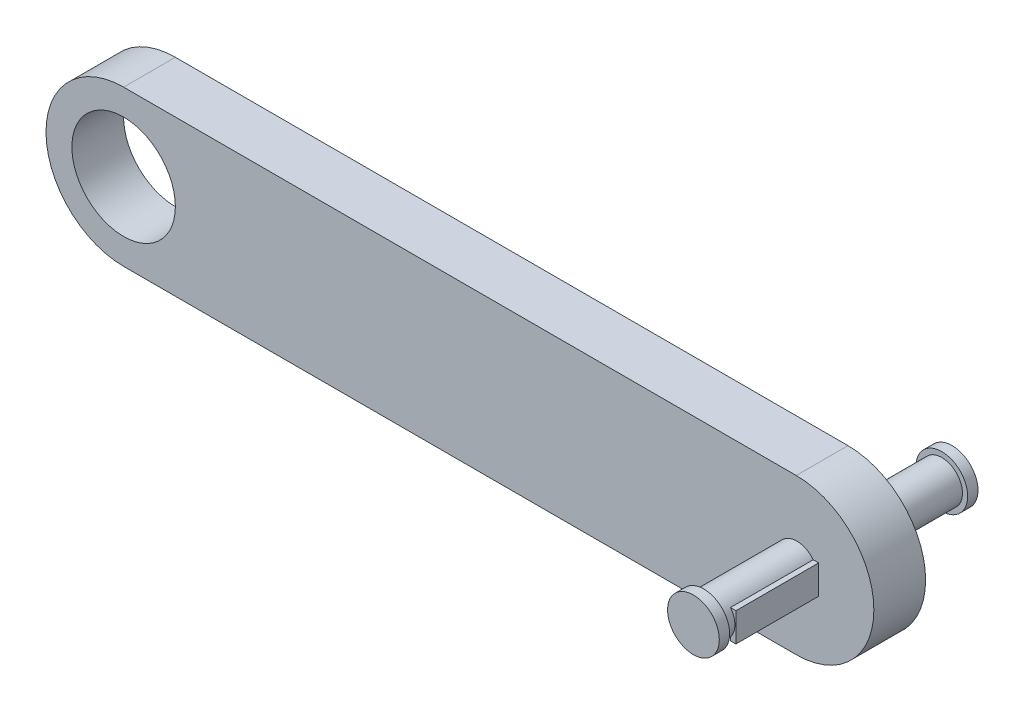
ISO-10303-21;
HEADER;
FILE_DESCRIPTION(('STEP AP214'),'2;1');
FILE_NAME('part.step','',(''),(''),'','','');
FILE_SCHEMA(('AUTOMOTIVE_DESIGN { 1 0 10303 214 1 1 1 1 }'));
ENDSEC;
DATA;
#1=APPLICATION_CONTEXT('core data for automotive mechanical design processes');
#2=APPLICATION_PROTOCOL_DEFINITION('international standard','automotive_design',2000,#1);
#3=PRODUCT_CONTEXT('',#1,'mechanical');
#4=PRODUCT('Part','Part','',(#3));
#5=PRODUCT_RELATED_PRODUCT_CATEGORY('part','',(#4));
#6=PRODUCT_DEFINITION_FORMATION('','',#4);
#7=PRODUCT_DEFINITION_CONTEXT('part definition',#1,'design');
#8=PRODUCT_DEFINITION('design','',#6,#7);
#9=PRODUCT_DEFINITION_SHAPE('','',#8);
#10=(LENGTH_UNIT() NAMED_UNIT(*) SI_UNIT(.MILLI.,.METRE.));
#11=(NAMED_UNIT(*) PLANE_ANGLE_UNIT() SI_UNIT($,.RADIAN.));
#12=(NAMED_UNIT(*) SI_UNIT($,.STERADIAN.) SOLID_ANGLE_UNIT());
#13=UNCERTAINTY_MEASURE_WITH_UNIT(LENGTH_MEASURE(1.E-05),#10,'distance_accuracy_value','');
#14=(GEOMETRIC_REPRESENTATION_CONTEXT(3) GLOBAL_UNCERTAINTY_ASSIGNED_CONTEXT((#13)) GLOBAL_UNIT_ASSIGNED_CONTEXT((#10,
#11,#12)) REPRESENTATION_CONTEXT('',''));
#15=CARTESIAN_POINT('',(0.,0.,0.));
#16=DIRECTION('',(0.,0.,1.));
#17=DIRECTION('',(1.,0.,0.));
#18=AXIS2_PLACEMENT_3D('',#15,#16,#17);
#19=CARTESIAN_POINT('',(-75.8515243902439,4.53018292682928,6.35));
#20=DIRECTION('',(0.,0.,1.));
#21=DIRECTION('',(1.,0.,0.));
#22=AXIS2_PLACEMENT_3D('',#19,#20,#21);
#23=PLANE('',#22);
#24=CARTESIAN_POINT('',(-75.8515243902439,4.53018292682928,6.35));
#25=DIRECTION('',(0.,0.,1.));
#26=DIRECTION('',(1.,0.,0.));
#27=AXIS2_PLACEMENT_3D('',#24,#25,#26);
#28=CIRCLE('',#27,9.525);
#29=CARTESIAN_POINT('',(-75.8515243902439,14.0551829268293,6.35));
#30=VERTEX_POINT('',#29);
#31=CARTESIAN_POINT('',(-75.8515243902439,-4.99481707317073,6.35));
#32=VERTEX_POINT('',#31);
#33=EDGE_CURVE('E163',#30,#32,#28,.T.);
#34=ORIENTED_EDGE('',*,*,#33,.T.);
#35=DIRECTION('',(1.,0.,0.));
#36=VECTOR('',#35,1.);
#37=CARTESIAN_POINT('',(-75.8515243902439,-4.99481707317073,6.35));
#38=LINE('',#37,#36);
#39=CARTESIAN_POINT('',(6.69847560975611,-4.99481707317073,6.35));
#40=VERTEX_POINT('',#39);
#41=EDGE_CURVE('E166',#32,#40,#38,.T.);
#42=ORIENTED_EDGE('',*,*,#41,.T.);
#43=CARTESIAN_POINT('',(6.69847560975611,4.53018292682928,6.35));
#44=DIRECTION('',(0.,0.,1.));
#45=DIRECTION('',(-1.,0.,0.));
#46=AXIS2_PLACEMENT_3D('',#43,#44,#45);
#47=CIRCLE('',#46,9.525);
#48=CARTESIAN_POINT('',(6.69847560975611,14.0551829268293,6.35));
#49=VERTEX_POINT('',#48);
#50=EDGE_CURVE('E169',#40,#49,#47,.T.);
#51=ORIENTED_EDGE('',*,*,#50,.T.);
#52=DIRECTION('',(-1.,0.,0.));
#53=VECTOR('',#52,1.);
#54=CARTESIAN_POINT('',(-75.8515243902439,14.0551829268293,6.35));
#55=LINE('',#54,#53);
#56=EDGE_CURVE('E171',#49,#30,#55,.T.);
#57=ORIENTED_EDGE('',*,*,#56,.T.);
#58=EDGE_LOOP('',(#34,#42,#51,#57));
#59=FACE_BOUND('',#58,.T.);
#60=CARTESIAN_POINT('',(-75.8515243902439,4.53018292682928,6.35));
#61=DIRECTION('',(0.,0.,1.));
#62=DIRECTION('',(1.,0.,0.));
#63=AXIS2_PLACEMENT_3D('',#60,#61,#62);
#64=CIRCLE('',#63,6.35);
#65=CARTESIAN_POINT('',(-69.5015243902439,4.53018292682928,6.35));
#66=VERTEX_POINT('',#65);
#67=EDGE_CURVE('E157',#66,#66,#64,.T.);
#68=ORIENTED_EDGE('',*,*,#67,.F.);
#69=EDGE_LOOP('',(#68));
#70=FACE_BOUND('',#69,.T.);
#71=DIRECTION('',(1.,0.,0.));
#72=VECTOR('',#71,1.);
#73=CARTESIAN_POINT('',(8.78764616862874,2.60212217105149,6.35));
#74=LINE('',#73,#72);
#75=CARTESIAN_POINT('',(8.78764616862875,2.60212217105149,6.35));
#76=VERTEX_POINT('',#75);
#77=CARTESIAN_POINT('',(9.45471088148153,2.60212217105149,6.35));
#78=VERTEX_POINT('',#77);
#79=EDGE_CURVE('E56',#76,#78,#74,.T.);
#80=ORIENTED_EDGE('',*,*,#79,.F.);
#81=DIRECTION('',(0.,-1.,0.));
#82=VECTOR('',#81,1.);
#83=CARTESIAN_POINT('',(8.78764616862874,6.14337806191401,6.35));
#84=LINE('',#83,#82);
#85=CARTESIAN_POINT('',(8.78764616862874,3.00710729584175,6.34999999999999));
#86=VERTEX_POINT('',#85);
#87=EDGE_CURVE('E130',#86,#76,#84,.T.);
#88=ORIENTED_EDGE('',*,*,#87,.F.);
#89=CARTESIAN_POINT('',(6.77943259066653,4.57524267887788,6.34999999999999));
#90=DIRECTION('',(0.,0.,1.));
#91=DIRECTION('',(1.,0.,0.));
#92=AXIS2_PLACEMENT_3D('',#89,#90,#91);
#93=CIRCLE('',#92,2.54793452707122);
#94=CARTESIAN_POINT('',(8.78764616862874,6.143378061914,6.34999999999999));
#95=VERTEX_POINT('',#94);
#96=EDGE_CURVE('E146',#86,#95,#93,.F.);
#97=ORIENTED_EDGE('',*,*,#96,.T.);
#98=DIRECTION('',(-1.,0.,0.));
#99=VECTOR('',#98,1.);
#100=CARTESIAN_POINT('',(8.78764616862874,6.14337806191401,6.35));
#101=LINE('',#100,#99);
#102=CARTESIAN_POINT('',(9.45471088148153,6.14337806191401,6.35));
#103=VERTEX_POINT('',#102);
#104=EDGE_CURVE('E118',#103,#95,#101,.T.);
#105=ORIENTED_EDGE('',*,*,#104,.F.);
#106=DIRECTION('',(0.,1.,0.));
#107=VECTOR('',#106,1.);
#108=CARTESIAN_POINT('',(9.45471088148153,6.14337806191401,6.35));
#109=LINE('',#108,#107);
#110=EDGE_CURVE('E61',#78,#103,#109,.T.);
#111=ORIENTED_EDGE('',*,*,#110,.F.);
#112=EDGE_LOOP('',(#80,#88,#97,#105,#111));
#113=FACE_BOUND('',#112,.T.);
#114=ADVANCED_FACE('F41',(#59,#70,#113),#23,.T.);
#115=CARTESIAN_POINT('',(6.77943259066653,4.57524267887788,-98.0542158930855));
#116=DIRECTION('',(0.,0.,1.));
#117=DIRECTION('',(1.,0.,0.));
#118=AXIS2_PLACEMENT_3D('',#115,#116,#117);
#119=CYLINDRICAL_SURFACE('',#118,2.54793452707122);
#120=CARTESIAN_POINT('',(6.77943259066653,4.57524267887788,17.78));
#121=DIRECTION('',(0.,0.,1.));
#122=DIRECTION('',(1.,0.,0.));
#123=AXIS2_PLACEMENT_3D('',#120,#121,#122);
#124=CIRCLE('',#123,2.54793452707122);
#125=CARTESIAN_POINT('',(9.32736711773775,4.57524267887788,17.78));
#126=VERTEX_POINT('',#125);
#127=EDGE_CURVE('E143',#126,#126,#124,.T.);
#128=ORIENTED_EDGE('',*,*,#127,.F.);
#129=EDGE_LOOP('',(#128));
#130=FACE_BOUND('',#129,.T.);
#131=ORIENTED_EDGE('',*,*,#96,.F.);
#132=DIRECTION('',(0.,0.,1.));
#133=VECTOR('',#132,1.);
#134=CARTESIAN_POINT('',(8.78764616862874,3.00710729584175,-98.0542158930855));
#135=LINE('',#134,#133);
#136=CARTESIAN_POINT('',(8.78764616862874,3.00710729584175,16.51));
#137=VERTEX_POINT('',#136);
#138=EDGE_CURVE('E12',#86,#137,#135,.T.);
#139=ORIENTED_EDGE('',*,*,#138,.T.);
#140=CARTESIAN_POINT('',(6.77943259066653,4.57524267887788,16.51));
#141=DIRECTION('',(0.,0.,1.));
#142=DIRECTION('',(1.,0.,0.));
#143=AXIS2_PLACEMENT_3D('',#140,#141,#142);
#144=CIRCLE('',#143,2.54793452707122);
#145=CARTESIAN_POINT('',(8.78764616862874,6.143378061914,16.51));
#146=VERTEX_POINT('',#145);
#147=EDGE_CURVE('E49',#146,#137,#144,.F.);
#148=ORIENTED_EDGE('',*,*,#147,.F.);
#149=DIRECTION('',(0.,0.,-1.));
#150=VECTOR('',#149,1.);
#151=CARTESIAN_POINT('',(8.78764616862874,6.14337806191401,16.51));
#152=LINE('',#151,#150);
#153=EDGE_CURVE('E378',#146,#95,#152,.T.);
#154=ORIENTED_EDGE('',*,*,#153,.T.);
#155=EDGE_LOOP('',(#131,#139,#148,#154));
#156=FACE_BOUND('',#155,.T.);
#157=ADVANCED_FACE('F217',(#130,#156),#119,.T.);
#158=CARTESIAN_POINT('',(-75.8515243902439,4.53018292682928,0.));
#159=DIRECTION('',(0.,0.,1.));
#160=DIRECTION('',(1.,0.,0.));
#161=AXIS2_PLACEMENT_3D('',#158,#159,#160);
#162=PLANE('',#161);
#163=CARTESIAN_POINT('',(-75.8515243902439,4.53018292682928,0.));
#164=DIRECTION('',(0.,0.,1.));
#165=DIRECTION('',(1.,0.,0.));
#166=AXIS2_PLACEMENT_3D('',#163,#164,#165);
#167=CIRCLE('',#166,9.525);
#168=CARTESIAN_POINT('',(-75.8515243902439,14.0551829268293,0.));
#169=VERTEX_POINT('',#168);
#170=CARTESIAN_POINT('',(-75.8515243902439,-4.99481707317073,0.));
#171=VERTEX_POINT('',#170);
#172=EDGE_CURVE('E160',#169,#171,#167,.T.);
#173=ORIENTED_EDGE('',*,*,#172,.F.);
#174=DIRECTION('',(-1.,0.,0.));
#175=VECTOR('',#174,1.);
#176=CARTESIAN_POINT('',(-75.8515243902439,14.0551829268293,0.));
#177=LINE('',#176,#175);
#178=CARTESIAN_POINT('',(6.69847560975611,14.0551829268293,0.));
#179=VERTEX_POINT('',#178);
#180=EDGE_CURVE('E167',#179,#169,#177,.T.);
#181=ORIENTED_EDGE('',*,*,#180,.F.);
#182=CARTESIAN_POINT('',(6.69847560975611,4.53018292682928,0.));
#183=DIRECTION('',(0.,0.,1.));
#184=DIRECTION('',(-1.,0.,0.));
#185=AXIS2_PLACEMENT_3D('',#182,#183,#184);
#186=CIRCLE('',#185,9.525);
#187=CARTESIAN_POINT('',(6.69847560975611,-4.99481707317073,0.));
#188=VERTEX_POINT('',#187);
#189=EDGE_CURVE('E178',#188,#179,#186,.T.);
#190=ORIENTED_EDGE('',*,*,#189,.F.);
#191=DIRECTION('',(1.,0.,0.));
#192=VECTOR('',#191,1.);
#193=CARTESIAN_POINT('',(-75.8515243902439,-4.99481707317073,0.));
#194=LINE('',#193,#192);
#195=EDGE_CURVE('E176',#171,#188,#194,.T.);
#196=ORIENTED_EDGE('',*,*,#195,.F.);
#197=EDGE_LOOP('',(#173,#181,#190,#196));
#198=FACE_BOUND('',#197,.T.);
#199=CARTESIAN_POINT('',(-75.8515243902439,4.53018292682928,0.));
#200=DIRECTION('',(0.,0.,1.));
#201=DIRECTION('',(1.,0.,0.));
#202=AXIS2_PLACEMENT_3D('',#199,#200,#201);
#203=CIRCLE('',#202,6.35);
#204=CARTESIAN_POINT('',(-69.5015243902439,4.53018292682928,0.));
#205=VERTEX_POINT('',#204);
#206=EDGE_CURVE('E156',#205,#205,#203,.T.);
#207=ORIENTED_EDGE('',*,*,#206,.T.);
#208=EDGE_LOOP('',(#207));
#209=FACE_BOUND('',#208,.T.);
#210=CARTESIAN_POINT('',(6.77943259066653,4.57524267887788,0.));
#211=DIRECTION('',(0.,0.,1.));
#212=DIRECTION('',(1.,0.,0.));
#213=AXIS2_PLACEMENT_3D('',#210,#211,#212);
#214=CIRCLE('',#213,2.54254977349149);
#215=CARTESIAN_POINT('',(4.23688281717505,4.57524267887788,0.));
#216=VERTEX_POINT('',#215);
#217=EDGE_CURVE('E134',#216,#216,#214,.F.);
#218=ORIENTED_EDGE('',*,*,#217,.F.);
#219=EDGE_LOOP('',(#218));
#220=FACE_BOUND('',#219,.T.);
#221=ADVANCED_FACE('F224',(#198,#209,#220),#162,.F.);
#222=CARTESIAN_POINT('',(-75.8515243902439,4.53018292682928,6.35));
#223=DIRECTION('',(0.,0.,-1.));
#224=DIRECTION('',(-1.,0.,0.));
#225=AXIS2_PLACEMENT_3D('',#222,#223,#224);
#226=CYLINDRICAL_SURFACE('',#225,9.525);
#227=ORIENTED_EDGE('',*,*,#172,.T.);
#228=DIRECTION('',(0.,0.,-1.));
#229=VECTOR('',#228,1.);
#230=CARTESIAN_POINT('',(-75.8515243902439,-4.99481707317073,6.35));
#231=LINE('',#230,#229);
#232=EDGE_CURVE('E189',#32,#171,#231,.T.);
#233=ORIENTED_EDGE('',*,*,#232,.F.);
#234=ORIENTED_EDGE('',*,*,#33,.F.);
#235=DIRECTION('',(0.,0.,-1.));
#236=VECTOR('',#235,1.);
#237=CARTESIAN_POINT('',(-75.8515243902439,14.0551829268293,6.35));
#238=LINE('',#237,#236);
#239=EDGE_CURVE('E173',#30,#169,#238,.T.);
#240=ORIENTED_EDGE('',*,*,#239,.T.);
#241=EDGE_LOOP('',(#227,#233,#234,#240));
#242=FACE_BOUND('',#241,.T.);
#243=ADVANCED_FACE('F43',(#242),#226,.T.);
#244=CARTESIAN_POINT('',(-75.8515243902439,-4.99481707317073,6.35));
#245=DIRECTION('',(0.,1.,0.));
#246=DIRECTION('',(-1.,0.,0.));
#247=AXIS2_PLACEMENT_3D('',#244,#245,#246);
#248=PLANE('',#247);
#249=ORIENTED_EDGE('',*,*,#195,.T.);
#250=DIRECTION('',(0.,0.,-1.));
#251=VECTOR('',#250,1.);
#252=CARTESIAN_POINT('',(6.69847560975611,-4.99481707317073,6.35));
#253=LINE('',#252,#251);
#254=EDGE_CURVE('E186',#40,#188,#253,.T.);
#255=ORIENTED_EDGE('',*,*,#254,.F.);
#256=ORIENTED_EDGE('',*,*,#41,.F.);
#257=ORIENTED_EDGE('',*,*,#232,.T.);
#258=EDGE_LOOP('',(#249,#255,#256,#257));
#259=FACE_BOUND('',#258,.T.);
#260=ADVANCED_FACE('F240',(#259),#248,.F.);
#261=CARTESIAN_POINT('',(6.69847560975611,4.53018292682928,6.35));
#262=DIRECTION('',(0.,0.,-1.));
#263=DIRECTION('',(-1.,0.,0.));
#264=AXIS2_PLACEMENT_3D('',#261,#262,#263);
#265=CYLINDRICAL_SURFACE('',#264,9.525);
#266=ORIENTED_EDGE('',*,*,#189,.T.);
#267=DIRECTION('',(0.,0.,-1.));
#268=VECTOR('',#267,1.);
#269=CARTESIAN_POINT('',(6.69847560975611,14.0551829268293,6.35));
#270=LINE('',#269,#268);
#271=EDGE_CURVE('E183',#49,#179,#270,.T.);
#272=ORIENTED_EDGE('',*,*,#271,.F.);
#273=ORIENTED_EDGE('',*,*,#50,.F.);
#274=ORIENTED_EDGE('',*,*,#254,.T.);
#275=EDGE_LOOP('',(#266,#272,#273,#274));
#276=FACE_BOUND('',#275,.T.);
#277=ADVANCED_FACE('F237',(#276),#265,.T.);
#278=CARTESIAN_POINT('',(-75.8515243902439,14.0551829268293,6.35));
#279=DIRECTION('',(0.,-1.,0.));
#280=DIRECTION('',(1.,0.,0.));
#281=AXIS2_PLACEMENT_3D('',#278,#279,#280);
#282=PLANE('',#281);
#283=ORIENTED_EDGE('',*,*,#180,.T.);
#284=ORIENTED_EDGE('',*,*,#239,.F.);
#285=ORIENTED_EDGE('',*,*,#56,.F.);
#286=ORIENTED_EDGE('',*,*,#271,.T.);
#287=EDGE_LOOP('',(#283,#284,#285,#286));
#288=FACE_BOUND('',#287,.T.);
#289=ADVANCED_FACE('F234',(#288),#282,.F.);
#290=CARTESIAN_POINT('',(-75.8515243902439,4.53018292682928,6.35));
#291=DIRECTION('',(0.,0.,-1.));
#292=DIRECTION('',(-1.,0.,0.));
#293=AXIS2_PLACEMENT_3D('',#290,#291,#292);
#294=CYLINDRICAL_SURFACE('',#293,6.35);
#295=ORIENTED_EDGE('',*,*,#67,.T.);
#296=EDGE_LOOP('',(#295));
#297=FACE_BOUND('',#296,.T.);
#298=ORIENTED_EDGE('',*,*,#206,.F.);
#299=EDGE_LOOP('',(#298));
#300=FACE_BOUND('',#299,.T.);
#301=ADVANCED_FACE('F230',(#297,#300),#294,.F.);
#302=CARTESIAN_POINT('',(-34.5765243902439,4.53018292682928,17.78));
#303=DIRECTION('',(0.,0.,1.));
#304=DIRECTION('',(1.,0.,0.));
#305=AXIS2_PLACEMENT_3D('',#302,#303,#304);
#306=PLANE('',#305);
#307=CARTESIAN_POINT('',(6.77943259066653,4.57524267887788,17.78));
#308=DIRECTION('',(0.,0.,1.));
#309=DIRECTION('',(1.,0.,0.));
#310=AXIS2_PLACEMENT_3D('',#307,#308,#309);
#311=CIRCLE('',#310,3.175);
#312=CARTESIAN_POINT('',(9.95443259066653,4.57524267887788,17.78));
#313=VERTEX_POINT('',#312);
#314=EDGE_CURVE('E149',#313,#313,#311,.F.);
#315=ORIENTED_EDGE('',*,*,#314,.T.);
#316=EDGE_LOOP('',(#315));
#317=FACE_BOUND('',#316,.T.);
#318=ORIENTED_EDGE('',*,*,#127,.T.);
#319=EDGE_LOOP('',(#318));
#320=FACE_BOUND('',#319,.T.);
#321=ADVANCED_FACE('F274',(#317,#320),#306,.F.);
#322=CARTESIAN_POINT('',(6.77943259066653,4.57524267887788,19.05));
#323=DIRECTION('',(0.,0.,1.));
#324=DIRECTION('',(1.,0.,0.));
#325=AXIS2_PLACEMENT_3D('',#322,#323,#324);
#326=PLANE('',#325);
#327=CARTESIAN_POINT('',(6.77943259066653,4.57524267887788,19.05));
#328=DIRECTION('',(0.,0.,1.));
#329=DIRECTION('',(1.,0.,0.));
#330=AXIS2_PLACEMENT_3D('',#327,#328,#329);
#331=CIRCLE('',#330,3.175);
#332=CARTESIAN_POINT('',(9.95443259066653,4.57524267887788,19.05));
#333=VERTEX_POINT('',#332);
#334=EDGE_CURVE('E150',#333,#333,#331,.T.);
#335=ORIENTED_EDGE('',*,*,#334,.T.);
#336=EDGE_LOOP('',(#335));
#337=FACE_BOUND('',#336,.T.);
#338=ADVANCED_FACE('F269',(#337),#326,.T.);
#339=CARTESIAN_POINT('',(6.77943259066653,4.57524267887788,-12.7));
#340=DIRECTION('',(0.,0.,1.));
#341=DIRECTION('',(1.,0.,0.));
#342=AXIS2_PLACEMENT_3D('',#339,#340,#341);
#343=CYLINDRICAL_SURFACE('',#342,3.175);
#344=CARTESIAN_POINT('',(9.95443259066653,4.57524267887788,17.78));
#345=CARTESIAN_POINT('',(9.95443259066653,4.57524267887788,17.7932291666667));
#346=CARTESIAN_POINT('',(9.95443259066653,4.57524267887788,17.8064583333333));
#347=CARTESIAN_POINT('',(9.95443259066653,4.57524267887788,17.8329166666667));
#348=CARTESIAN_POINT('',(9.95443259066653,4.57524267887788,17.8461458333333));
#349=CARTESIAN_POINT('',(9.95443259066653,4.57524267887788,17.8726041666667));
#350=CARTESIAN_POINT('',(9.95443259066653,4.57524267887788,17.8858333333333));
#351=CARTESIAN_POINT('',(9.95443259066653,4.57524267887788,17.9122916666667));
#352=CARTESIAN_POINT('',(9.95443259066653,4.57524267887788,17.9255208333333));
#353=CARTESIAN_POINT('',(9.95443259066653,4.57524267887788,17.9519791666667));
#354=CARTESIAN_POINT('',(9.95443259066653,4.57524267887788,17.9652083333333));
#355=CARTESIAN_POINT('',(9.95443259066653,4.57524267887788,17.9916666666667));
#356=CARTESIAN_POINT('',(9.95443259066653,4.57524267887788,18.0048958333333));
#357=CARTESIAN_POINT('',(9.95443259066653,4.57524267887788,18.0313541666667));
#358=CARTESIAN_POINT('',(9.95443259066653,4.57524267887788,18.0445833333333));
#359=CARTESIAN_POINT('',(9.95443259066653,4.57524267887788,18.0710416666667));
#360=CARTESIAN_POINT('',(9.95443259066653,4.57524267887788,18.0842708333333));
#361=CARTESIAN_POINT('',(9.95443259066653,4.57524267887788,18.1107291666667));
#362=CARTESIAN_POINT('',(9.95443259066653,4.57524267887788,18.1239583333333));
#363=CARTESIAN_POINT('',(9.95443259066653,4.57524267887788,18.1504166666667));
#364=CARTESIAN_POINT('',(9.95443259066653,4.57524267887788,18.1636458333333));
#365=CARTESIAN_POINT('',(9.95443259066653,4.57524267887788,18.1901041666667));
#366=CARTESIAN_POINT('',(9.95443259066653,4.57524267887788,18.2033333333333));
#367=CARTESIAN_POINT('',(9.95443259066653,4.57524267887788,18.2297916666667));
#368=CARTESIAN_POINT('',(9.95443259066653,4.57524267887788,18.2430208333333));
#369=CARTESIAN_POINT('',(9.95443259066653,4.57524267887788,18.2694791666667));
#370=CARTESIAN_POINT('',(9.95443259066653,4.57524267887788,18.2827083333333));
#371=CARTESIAN_POINT('',(9.95443259066653,4.57524267887788,18.3091666666667));
#372=CARTESIAN_POINT('',(9.95443259066653,4.57524267887788,18.3223958333333));
#373=CARTESIAN_POINT('',(9.95443259066653,4.57524267887788,18.3488541666667));
#374=CARTESIAN_POINT('',(9.95443259066653,4.57524267887788,18.3620833333333));
#375=CARTESIAN_POINT('',(9.95443259066653,4.57524267887788,18.3885416666667));
#376=CARTESIAN_POINT('',(9.95443259066653,4.57524267887788,18.4017708333333));
#377=CARTESIAN_POINT('',(9.95443259066653,4.57524267887788,18.4282291666667));
#378=CARTESIAN_POINT('',(9.95443259066653,4.57524267887788,18.4414583333333));
#379=CARTESIAN_POINT('',(9.95443259066653,4.57524267887788,18.4679166666667));
#380=CARTESIAN_POINT('',(9.95443259066653,4.57524267887788,18.4811458333333));
#381=CARTESIAN_POINT('',(9.95443259066653,4.57524267887788,18.5076041666667));
#382=CARTESIAN_POINT('',(9.95443259066653,4.57524267887788,18.5208333333333));
#383=CARTESIAN_POINT('',(9.95443259066653,4.57524267887788,18.5472916666667));
#384=CARTESIAN_POINT('',(9.95443259066653,4.57524267887788,18.5605208333333));
#385=CARTESIAN_POINT('',(9.95443259066653,4.57524267887788,18.5869791666667));
#386=CARTESIAN_POINT('',(9.95443259066653,4.57524267887788,18.6002083333333));
#387=CARTESIAN_POINT('',(9.95443259066653,4.57524267887788,18.6266666666667));
#388=CARTESIAN_POINT('',(9.95443259066653,4.57524267887788,18.6398958333333));
#389=CARTESIAN_POINT('',(9.95443259066653,4.57524267887788,18.6663541666667));
#390=CARTESIAN_POINT('',(9.95443259066653,4.57524267887788,18.6795833333333));
#391=CARTESIAN_POINT('',(9.95443259066653,4.57524267887788,18.7060416666667));
#392=CARTESIAN_POINT('',(9.95443259066653,4.57524267887788,18.7192708333333));
#393=CARTESIAN_POINT('',(9.95443259066653,4.57524267887788,18.7457291666667));
#394=CARTESIAN_POINT('',(9.95443259066653,4.57524267887788,18.7589583333333));
#395=CARTESIAN_POINT('',(9.95443259066653,4.57524267887788,18.7854166666667));
#396=CARTESIAN_POINT('',(9.95443259066653,4.57524267887788,18.7986458333333));
#397=CARTESIAN_POINT('',(9.95443259066653,4.57524267887788,18.8251041666667));
#398=CARTESIAN_POINT('',(9.95443259066653,4.57524267887788,18.8383333333333));
#399=CARTESIAN_POINT('',(9.95443259066653,4.57524267887788,18.8647916666667));
#400=CARTESIAN_POINT('',(9.95443259066653,4.57524267887788,18.8780208333333));
#401=CARTESIAN_POINT('',(9.95443259066653,4.57524267887788,18.9044791666667));
#402=CARTESIAN_POINT('',(9.95443259066653,4.57524267887788,18.9177083333333));
#403=CARTESIAN_POINT('',(9.95443259066653,4.57524267887788,18.9441666666667));
#404=CARTESIAN_POINT('',(9.95443259066653,4.57524267887788,18.9573958333333));
#405=CARTESIAN_POINT('',(9.95443259066653,4.57524267887788,18.9838541666667));
#406=CARTESIAN_POINT('',(9.95443259066653,4.57524267887788,18.9970833333333));
#407=CARTESIAN_POINT('',(9.95443259066653,4.57524267887788,19.0235416666667));
#408=CARTESIAN_POINT('',(9.95443259066653,4.57524267887788,19.0367708333333));
#409=CARTESIAN_POINT('',(9.95443259066653,4.57524267887788,19.05));
#410=B_SPLINE_CURVE_WITH_KNOTS('',3,(#344,#345,#346,#347,#348,#349,#350,#351,#352,#353,#354,
#355,#356,#357,#358,#359,#360,#361,#362,#363,#364,#365,#366,#367,#368,#369,#370,#371,#372,#373,
#374,#375,#376,#377,#378,#379,#380,#381,#382,#383,#384,#385,#386,#387,#388,#389,#390,#391,#392,
#393,#394,#395,#396,#397,#398,#399,#400,#401,#402,#403,#404,#405,#406,#407,#408,#409),
.UNSPECIFIED.,.F.,.F.,(4,2,2,2,2,2,2,2,2,2,2,2,2,2,2,2,2,2,2,2,2,2,2,2,2,2,2,2,2,2,2,2,4),(0.,
0.0396874999999963,0.0793749999999996,0.119062499999996,0.158749999999999,0.198437499999995,
0.238124999999999,0.277812499999995,0.317499999999998,0.357187500000002,0.396874999999998,
0.436562500000001,0.476249999999998,0.515937500000001,0.555624999999997,0.5953125,
0.634999999999997,0.6746875,0.714374999999996,0.7540625,0.793749999999996,0.833437499999992,
0.873124999999995,0.912812499999992,0.952499999999995,0.992187499999991,1.03187499999999,
1.07156249999999,1.11124999999999,1.15093749999999,1.19062499999999,1.23031249999999,
1.26999999999999),.UNSPECIFIED.);
#411=EDGE_CURVE('BSEAM205',#313,#333,#410,.T.);
#412=ORIENTED_EDGE('',*,*,#314,.F.);
#413=ORIENTED_EDGE('',*,*,#334,.F.);
#414=ORIENTED_EDGE('',*,*,#411,.T.);
#415=ORIENTED_EDGE('',*,*,#411,.F.);
#416=EDGE_LOOP('',(#412,#414,#413,#415));
#417=FACE_BOUND('',#416,.T.);
#418=ADVANCED_FACE('F205',(#417),#343,.T.);
#419=CARTESIAN_POINT('',(6.77943259066653,4.57524267887788,104.404215893085));
#420=DIRECTION('',(0.,0.,-1.));
#421=DIRECTION('',(-1.,0.,0.));
#422=AXIS2_PLACEMENT_3D('',#419,#420,#421);
#423=CYLINDRICAL_SURFACE('',#422,2.54254977349149);
#424=CARTESIAN_POINT('',(6.77943259066653,4.57524267887788,-11.43));
#425=DIRECTION('',(0.,0.,-1.));
#426=DIRECTION('',(-1.,0.,0.));
#427=AXIS2_PLACEMENT_3D('',#424,#425,#426);
#428=CIRCLE('',#427,2.54254977349149);
#429=CARTESIAN_POINT('',(4.23688281717505,4.57524267887788,-11.43));
#430=VERTEX_POINT('',#429);
#431=EDGE_CURVE('E131',#430,#430,#428,.T.);
#432=CARTESIAN_POINT('',(4.23688281717505,4.57524267887788,-11.43));
#433=CARTESIAN_POINT('',(4.23688281717505,4.57524267887788,-11.3109375));
#434=CARTESIAN_POINT('',(4.23688281717505,4.57524267887788,-11.191875));
#435=CARTESIAN_POINT('',(4.23688281717505,4.57524267887788,-10.95375));
#436=CARTESIAN_POINT('',(4.23688281717505,4.57524267887788,-10.8346875));
#437=CARTESIAN_POINT('',(4.23688281717505,4.57524267887788,-10.5965625));
#438=CARTESIAN_POINT('',(4.23688281717505,4.57524267887788,-10.4775));
#439=CARTESIAN_POINT('',(4.23688281717505,4.57524267887788,-10.239375));
#440=CARTESIAN_POINT('',(4.23688281717505,4.57524267887788,-10.1203125));
#441=CARTESIAN_POINT('',(4.23688281717505,4.57524267887788,-9.88218750000001));
#442=CARTESIAN_POINT('',(4.23688281717505,4.57524267887788,-9.76312500000001));
#443=CARTESIAN_POINT('',(4.23688281717505,4.57524267887788,-9.52500000000001));
#444=CARTESIAN_POINT('',(4.23688281717505,4.57524267887788,-9.40593750000001));
#445=CARTESIAN_POINT('',(4.23688281717505,4.57524267887788,-9.16781250000001));
#446=CARTESIAN_POINT('',(4.23688281717505,4.57524267887788,-9.04875000000001));
#447=CARTESIAN_POINT('',(4.23688281717505,4.57524267887788,-8.81062500000001));
#448=CARTESIAN_POINT('',(4.23688281717505,4.57524267887788,-8.69156250000001));
#449=CARTESIAN_POINT('',(4.23688281717505,4.57524267887788,-8.45343750000001));
#450=CARTESIAN_POINT('',(4.23688281717505,4.57524267887788,-8.33437500000001));
#451=CARTESIAN_POINT('',(4.23688281717505,4.57524267887788,-8.09625000000001));
#452=CARTESIAN_POINT('',(4.23688281717505,4.57524267887788,-7.97718750000001));
#453=CARTESIAN_POINT('',(4.23688281717505,4.57524267887788,-7.73906250000001));
#454=CARTESIAN_POINT('',(4.23688281717505,4.57524267887788,-7.62000000000001));
#455=CARTESIAN_POINT('',(4.23688281717505,4.57524267887788,-7.38187500000001));
#456=CARTESIAN_POINT('',(4.23688281717505,4.57524267887788,-7.26281250000002));
#457=CARTESIAN_POINT('',(4.23688281717505,4.57524267887788,-7.02468750000001));
#458=CARTESIAN_POINT('',(4.23688281717505,4.57524267887788,-6.90562500000001));
#459=CARTESIAN_POINT('',(4.23688281717505,4.57524267887788,-6.66750000000001));
#460=CARTESIAN_POINT('',(4.23688281717505,4.57524267887788,-6.54843750000001));
#461=CARTESIAN_POINT('',(4.23688281717505,4.57524267887788,-6.31031250000001));
#462=CARTESIAN_POINT('',(4.23688281717505,4.57524267887788,-6.19125000000001));
#463=CARTESIAN_POINT('',(4.23688281717505,4.57524267887788,-5.95312500000001));
#464=CARTESIAN_POINT('',(4.23688281717505,4.57524267887788,-5.83406250000001));
#465=CARTESIAN_POINT('',(4.23688281717505,4.57524267887788,-5.59593750000001));
#466=CARTESIAN_POINT('',(4.23688281717505,4.57524267887788,-5.47687500000002));
#467=CARTESIAN_POINT('',(4.23688281717505,4.57524267887788,-5.23875000000001));
#468=CARTESIAN_POINT('',(4.23688281717505,4.57524267887788,-5.11968750000001));
#469=CARTESIAN_POINT('',(4.23688281717505,4.57524267887788,-4.88156250000001));
#470=CARTESIAN_POINT('',(4.23688281717505,4.57524267887788,-4.76250000000001));
#471=CARTESIAN_POINT('',(4.23688281717505,4.57524267887788,-4.52437500000001));
#472=CARTESIAN_POINT('',(4.23688281717505,4.57524267887788,-4.40531250000001));
#473=CARTESIAN_POINT('',(4.23688281717505,4.57524267887788,-4.16718750000001));
#474=CARTESIAN_POINT('',(4.23688281717505,4.57524267887788,-4.04812500000001));
#475=CARTESIAN_POINT('',(4.23688281717505,4.57524267887788,-3.81000000000001));
#476=CARTESIAN_POINT('',(4.23688281717505,4.57524267887788,-3.69093750000001));
#477=CARTESIAN_POINT('',(4.23688281717505,4.57524267887788,-3.45281250000001));
#478=CARTESIAN_POINT('',(4.23688281717505,4.57524267887788,-3.33375000000001));
#479=CARTESIAN_POINT('',(4.23688281717505,4.57524267887788,-3.09562500000001));
#480=CARTESIAN_POINT('',(4.23688281717505,4.57524267887788,-2.97656250000001));
#481=CARTESIAN_POINT('',(4.23688281717505,4.57524267887788,-2.73843750000001));
#482=CARTESIAN_POINT('',(4.23688281717505,4.57524267887788,-2.61937500000002));
#483=CARTESIAN_POINT('',(4.23688281717505,4.57524267887788,-2.38125000000002));
#484=CARTESIAN_POINT('',(4.23688281717505,4.57524267887788,-2.26218750000001));
#485=CARTESIAN_POINT('',(4.23688281717505,4.57524267887788,-2.02406250000001));
#486=CARTESIAN_POINT('',(4.23688281717505,4.57524267887788,-1.90500000000001));
#487=CARTESIAN_POINT('',(4.23688281717505,4.57524267887788,-1.66687500000002));
#488=CARTESIAN_POINT('',(4.23688281717505,4.57524267887788,-1.54781250000002));
#489=CARTESIAN_POINT('',(4.23688281717505,4.57524267887788,-1.30968750000002));
#490=CARTESIAN_POINT('',(4.23688281717505,4.57524267887788,-1.19062500000001));
#491=CARTESIAN_POINT('',(4.23688281717505,4.57524267887788,-0.952500000000014));
#492=CARTESIAN_POINT('',(4.23688281717505,4.57524267887788,-0.833437500000015));
#493=CARTESIAN_POINT('',(4.23688281717505,4.57524267887788,-0.595312500000014));
#494=CARTESIAN_POINT('',(4.23688281717505,4.57524267887788,-0.476250000000011));
#495=CARTESIAN_POINT('',(4.23688281717505,4.57524267887788,-0.23812500000001));
#496=CARTESIAN_POINT('',(4.23688281717505,4.57524267887788,-0.119062500000012));
#497=CARTESIAN_POINT('',(4.23688281717505,4.57524267887788,0.));
#498=B_SPLINE_CURVE_WITH_KNOTS('',3,(#432,#433,#434,#435,#436,#437,#438,#439,#440,#441,#442,
#443,#444,#445,#446,#447,#448,#449,#450,#451,#452,#453,#454,#455,#456,#457,#458,#459,#460,#461,
#462,#463,#464,#465,#466,#467,#468,#469,#470,#471,#472,#473,#474,#475,#476,#477,#478,#479,#480,
#481,#482,#483,#484,#485,#486,#487,#488,#489,#490,#491,#492,#493,#494,#495,#496,#497),
.UNSPECIFIED.,.F.,.F.,(4,2,2,2,2,2,2,2,2,2,2,2,2,2,2,2,2,2,2,2,2,2,2,2,2,2,2,2,2,2,2,2,4),(0.,
0.357187499999995,0.714375000000003,1.0715625,1.42875000000001,1.7859375,2.143125,2.5003125,
2.8575,3.21468749999999,3.571875,3.9290625,4.28624999999999,4.6434375,5.00062499999999,
5.3578125,5.715,6.07218749999999,6.429375,6.7865625,7.14375,7.5009375,7.85812499999999,
8.2153125,8.5725,8.92968749999999,9.286875,9.6440625,10.00125,10.3584375,10.715625,11.0728125,
11.43),.UNSPECIFIED.);
#499=EDGE_CURVE('BSEAM213',#430,#216,#498,.T.);
#500=ORIENTED_EDGE('',*,*,#431,.F.);
#501=ORIENTED_EDGE('',*,*,#217,.T.);
#502=ORIENTED_EDGE('',*,*,#499,.T.);
#503=ORIENTED_EDGE('',*,*,#499,.F.);
#504=EDGE_LOOP('',(#500,#502,#501,#503));
#505=FACE_BOUND('',#504,.T.);
#506=ADVANCED_FACE('F213',(#505),#423,.T.);
#507=CARTESIAN_POINT('',(-34.5765243902439,4.53018292682928,-11.43));
#508=DIRECTION('',(0.,0.,-1.));
#509=DIRECTION('',(-1.,0.,0.));
#510=AXIS2_PLACEMENT_3D('',#507,#508,#509);
#511=PLANE('',#510);
#512=CARTESIAN_POINT('',(6.77943259066653,4.57524267887788,-11.43));
#513=DIRECTION('',(0.,0.,-1.));
#514=DIRECTION('',(-1.,0.,0.));
#515=AXIS2_PLACEMENT_3D('',#512,#513,#514);
#516=CIRCLE('',#515,3.175);
#517=CARTESIAN_POINT('',(9.95443259066653,4.57524267887788,-11.43));
#518=VERTEX_POINT('',#517);
#519=EDGE_CURVE('E142',#518,#518,#516,.F.);
#520=ORIENTED_EDGE('',*,*,#519,.T.);
#521=EDGE_LOOP('',(#520));
#522=FACE_BOUND('',#521,.T.);
#523=ORIENTED_EDGE('',*,*,#431,.T.);
#524=EDGE_LOOP('',(#523));
#525=FACE_BOUND('',#524,.T.);
#526=ADVANCED_FACE('F197',(#522,#525),#511,.F.);
#527=CARTESIAN_POINT('',(6.77943259066653,4.57524267887788,-12.7));
#528=DIRECTION('',(0.,0.,1.));
#529=DIRECTION('',(1.,0.,0.));
#530=AXIS2_PLACEMENT_3D('',#527,#528,#529);
#531=PLANE('',#530);
#532=CARTESIAN_POINT('',(6.77943259066653,4.57524267887788,-12.7));
#533=DIRECTION('',(0.,0.,1.));
#534=DIRECTION('',(1.,0.,0.));
#535=AXIS2_PLACEMENT_3D('',#532,#533,#534);
#536=CIRCLE('',#535,3.175);
#537=CARTESIAN_POINT('',(9.95443259066653,4.57524267887788,-12.7));
#538=VERTEX_POINT('',#537);
#539=EDGE_CURVE('E153',#538,#538,#536,.T.);
#540=ORIENTED_EDGE('',*,*,#539,.F.);
#541=EDGE_LOOP('',(#540));
#542=FACE_BOUND('',#541,.T.);
#543=ADVANCED_FACE('F203',(#542),#531,.F.);
#544=CARTESIAN_POINT('',(9.95443259066653,4.57524267887788,-11.43));
#545=CARTESIAN_POINT('',(9.95443259066653,4.57524267887788,-11.4432291666667));
#546=CARTESIAN_POINT('',(9.95443259066653,4.57524267887788,-11.4564583333333));
#547=CARTESIAN_POINT('',(9.95443259066653,4.57524267887788,-11.4829166666667));
#548=CARTESIAN_POINT('',(9.95443259066653,4.57524267887788,-11.4961458333333));
#549=CARTESIAN_POINT('',(9.95443259066653,4.57524267887788,-11.5226041666667));
#550=CARTESIAN_POINT('',(9.95443259066653,4.57524267887788,-11.5358333333333));
#551=CARTESIAN_POINT('',(9.95443259066653,4.57524267887788,-11.5622916666667));
#552=CARTESIAN_POINT('',(9.95443259066653,4.57524267887788,-11.5755208333333));
#553=CARTESIAN_POINT('',(9.95443259066653,4.57524267887788,-11.6019791666667));
#554=CARTESIAN_POINT('',(9.95443259066653,4.57524267887788,-11.6152083333333));
#555=CARTESIAN_POINT('',(9.95443259066653,4.57524267887788,-11.6416666666667));
#556=CARTESIAN_POINT('',(9.95443259066653,4.57524267887788,-11.6548958333333));
#557=CARTESIAN_POINT('',(9.95443259066653,4.57524267887788,-11.6813541666667));
#558=CARTESIAN_POINT('',(9.95443259066653,4.57524267887788,-11.6945833333333));
#559=CARTESIAN_POINT('',(9.95443259066653,4.57524267887788,-11.7210416666667));
#560=CARTESIAN_POINT('',(9.95443259066653,4.57524267887788,-11.7342708333333));
#561=CARTESIAN_POINT('',(9.95443259066653,4.57524267887788,-11.7607291666667));
#562=CARTESIAN_POINT('',(9.95443259066653,4.57524267887788,-11.7739583333333));
#563=CARTESIAN_POINT('',(9.95443259066653,4.57524267887788,-11.8004166666667));
#564=CARTESIAN_POINT('',(9.95443259066653,4.57524267887788,-11.8136458333333));
#565=CARTESIAN_POINT('',(9.95443259066653,4.57524267887788,-11.8401041666667));
#566=CARTESIAN_POINT('',(9.95443259066653,4.57524267887788,-11.8533333333333));
#567=CARTESIAN_POINT('',(9.95443259066653,4.57524267887788,-11.8797916666667));
#568=CARTESIAN_POINT('',(9.95443259066653,4.57524267887788,-11.8930208333333));
#569=CARTESIAN_POINT('',(9.95443259066653,4.57524267887788,-11.9194791666667));
#570=CARTESIAN_POINT('',(9.95443259066653,4.57524267887788,-11.9327083333333));
#571=CARTESIAN_POINT('',(9.95443259066653,4.57524267887788,-11.9591666666667));
#572=CARTESIAN_POINT('',(9.95443259066653,4.57524267887788,-11.9723958333333));
#573=CARTESIAN_POINT('',(9.95443259066653,4.57524267887788,-11.9988541666667));
#574=CARTESIAN_POINT('',(9.95443259066653,4.57524267887788,-12.0120833333333));
#575=CARTESIAN_POINT('',(9.95443259066653,4.57524267887788,-12.0385416666667));
#576=CARTESIAN_POINT('',(9.95443259066653,4.57524267887788,-12.0517708333333));
#577=CARTESIAN_POINT('',(9.95443259066653,4.57524267887788,-12.0782291666667));
#578=CARTESIAN_POINT('',(9.95443259066653,4.57524267887788,-12.0914583333333));
#579=CARTESIAN_POINT('',(9.95443259066653,4.57524267887788,-12.1179166666667));
#580=CARTESIAN_POINT('',(9.95443259066653,4.57524267887788,-12.1311458333333));
#581=CARTESIAN_POINT('',(9.95443259066653,4.57524267887788,-12.1576041666667));
#582=CARTESIAN_POINT('',(9.95443259066653,4.57524267887788,-12.1708333333333));
#583=CARTESIAN_POINT('',(9.95443259066653,4.57524267887788,-12.1972916666667));
#584=CARTESIAN_POINT('',(9.95443259066653,4.57524267887788,-12.2105208333333));
#585=CARTESIAN_POINT('',(9.95443259066653,4.57524267887788,-12.2369791666667));
#586=CARTESIAN_POINT('',(9.95443259066653,4.57524267887788,-12.2502083333333));
#587=CARTESIAN_POINT('',(9.95443259066653,4.57524267887788,-12.2766666666667));
#588=CARTESIAN_POINT('',(9.95443259066653,4.57524267887788,-12.2898958333333));
#589=CARTESIAN_POINT('',(9.95443259066653,4.57524267887788,-12.3163541666667));
#590=CARTESIAN_POINT('',(9.95443259066653,4.57524267887788,-12.3295833333333));
#591=CARTESIAN_POINT('',(9.95443259066653,4.57524267887788,-12.3560416666667));
#592=CARTESIAN_POINT('',(9.95443259066653,4.57524267887788,-12.3692708333333));
#593=CARTESIAN_POINT('',(9.95443259066653,4.57524267887788,-12.3957291666667));
#594=CARTESIAN_POINT('',(9.95443259066653,4.57524267887788,-12.4089583333333));
#595=CARTESIAN_POINT('',(9.95443259066653,4.57524267887788,-12.4354166666667));
#596=CARTESIAN_POINT('',(9.95443259066653,4.57524267887788,-12.4486458333333));
#597=CARTESIAN_POINT('',(9.95443259066653,4.57524267887788,-12.4751041666667));
#598=CARTESIAN_POINT('',(9.95443259066653,4.57524267887788,-12.4883333333333));
#599=CARTESIAN_POINT('',(9.95443259066653,4.57524267887788,-12.5147916666667));
#600=CARTESIAN_POINT('',(9.95443259066653,4.57524267887788,-12.5280208333333));
#601=CARTESIAN_POINT('',(9.95443259066653,4.57524267887788,-12.5544791666667));
#602=CARTESIAN_POINT('',(9.95443259066653,4.57524267887788,-12.5677083333333));
#603=CARTESIAN_POINT('',(9.95443259066653,4.57524267887788,-12.5941666666667));
#604=CARTESIAN_POINT('',(9.95443259066653,4.57524267887788,-12.6073958333333));
#605=CARTESIAN_POINT('',(9.95443259066653,4.57524267887788,-12.6338541666667));
#606=CARTESIAN_POINT('',(9.95443259066653,4.57524267887788,-12.6470833333333));
#607=CARTESIAN_POINT('',(9.95443259066653,4.57524267887788,-12.6735416666667));
#608=CARTESIAN_POINT('',(9.95443259066653,4.57524267887788,-12.6867708333333));
#609=CARTESIAN_POINT('',(9.95443259066653,4.57524267887788,-12.7));
#610=B_SPLINE_CURVE_WITH_KNOTS('',3,(#544,#545,#546,#547,#548,#549,#550,#551,#552,#553,#554,
#555,#556,#557,#558,#559,#560,#561,#562,#563,#564,#565,#566,#567,#568,#569,#570,#571,#572,#573,
#574,#575,#576,#577,#578,#579,#580,#581,#582,#583,#584,#585,#586,#587,#588,#589,#590,#591,#592,
#593,#594,#595,#596,#597,#598,#599,#600,#601,#602,#603,#604,#605,#606,#607,#608,#609),
.UNSPECIFIED.,.F.,.F.,(4,2,2,2,2,2,2,2,2,2,2,2,2,2,2,2,2,2,2,2,2,2,2,2,2,2,2,2,2,2,2,2,4),(0.,
0.0396875000000015,0.0793750000000013,0.119062500000001,0.158750000000001,0.198437500000001,
0.238125,0.2778125,0.3175,0.3571875,0.396875000000001,0.436562500000001,0.476250000000001,
0.515937500000001,0.555625000000001,0.5953125,0.635,0.674687500000002,0.714375000000001,
0.754062500000001,0.793750000000001,0.833437500000001,0.873125000000001,0.9128125,0.9525,
0.992187500000002,1.031875,1.0715625,1.11125,1.1509375,1.190625,1.2303125,1.27),.UNSPECIFIED.);
#611=EDGE_CURVE('BSEAM200',#518,#538,#610,.T.);
#612=ORIENTED_EDGE('',*,*,#519,.F.);
#613=ORIENTED_EDGE('',*,*,#539,.T.);
#614=ORIENTED_EDGE('',*,*,#611,.T.);
#615=ORIENTED_EDGE('',*,*,#611,.F.);
#616=EDGE_LOOP('',(#612,#614,#613,#615));
#617=FACE_BOUND('',#616,.T.);
#618=ADVANCED_FACE('F200',(#617),#343,.T.);
#619=CARTESIAN_POINT('',(8.78764616862874,6.14337806191401,16.51));
#620=DIRECTION('',(1.,0.,0.));
#621=DIRECTION('',(0.,0.,-1.));
#622=AXIS2_PLACEMENT_3D('',#619,#620,#621);
#623=PLANE('',#622);
#624=ORIENTED_EDGE('',*,*,#138,.F.);
#625=ORIENTED_EDGE('',*,*,#87,.T.);
#626=DIRECTION('',(0.,0.,-1.));
#627=VECTOR('',#626,1.);
#628=CARTESIAN_POINT('',(8.78764616862874,2.60212217105149,16.51));
#629=LINE('',#628,#627);
#630=CARTESIAN_POINT('',(8.78764616862874,2.60212217105149,16.51));
#631=VERTEX_POINT('',#630);
#632=EDGE_CURVE('E123',#631,#76,#629,.T.);
#633=ORIENTED_EDGE('',*,*,#632,.F.);
#634=DIRECTION('',(0.,-1.,0.));
#635=VECTOR('',#634,1.);
#636=CARTESIAN_POINT('',(8.78764616862874,6.14337806191401,16.51));
#637=LINE('',#636,#635);
#638=EDGE_CURVE('E109',#137,#631,#637,.T.);
#639=ORIENTED_EDGE('',*,*,#638,.F.);
#640=EDGE_LOOP('',(#624,#625,#633,#639));
#641=FACE_BOUND('',#640,.T.);
#642=ADVANCED_FACE('F129',(#641),#623,.F.);
#643=CARTESIAN_POINT('',(8.78764616862874,2.60212217105149,16.51));
#644=DIRECTION('',(0.,1.,0.));
#645=DIRECTION('',(0.,0.,1.));
#646=AXIS2_PLACEMENT_3D('',#643,#644,#645);
#647=PLANE('',#646);
#648=ORIENTED_EDGE('',*,*,#79,.T.);
#649=DIRECTION('',(0.,0.,-1.));
#650=VECTOR('',#649,1.);
#651=CARTESIAN_POINT('',(9.45471088148153,2.60212217105149,16.51));
#652=LINE('',#651,#650);
#653=CARTESIAN_POINT('',(9.45471088148153,2.60212217105149,16.51));
#654=VERTEX_POINT('',#653);
#655=EDGE_CURVE('E125',#654,#78,#652,.T.);
#656=ORIENTED_EDGE('',*,*,#655,.F.);
#657=DIRECTION('',(1.,0.,0.));
#658=VECTOR('',#657,1.);
#659=CARTESIAN_POINT('',(8.78764616862874,2.60212217105149,16.51));
#660=LINE('',#659,#658);
#661=EDGE_CURVE('E113',#631,#654,#660,.T.);
#662=ORIENTED_EDGE('',*,*,#661,.F.);
#663=ORIENTED_EDGE('',*,*,#632,.T.);
#664=EDGE_LOOP('',(#648,#656,#662,#663));
#665=FACE_BOUND('',#664,.T.);
#666=ADVANCED_FACE('F122',(#665),#647,.F.);
#667=CARTESIAN_POINT('',(9.45471088148153,6.14337806191401,16.51));
#668=DIRECTION('',(-1.,0.,0.));
#669=DIRECTION('',(0.,0.,1.));
#670=AXIS2_PLACEMENT_3D('',#667,#668,#669);
#671=PLANE('',#670);
#672=ORIENTED_EDGE('',*,*,#110,.T.);
#673=DIRECTION('',(0.,0.,-1.));
#674=VECTOR('',#673,1.);
#675=CARTESIAN_POINT('',(9.45471088148153,6.14337806191401,16.51));
#676=LINE('',#675,#674);
#677=CARTESIAN_POINT('',(9.45471088148153,6.14337806191401,16.51));
#678=VERTEX_POINT('',#677);
#679=EDGE_CURVE('E136',#678,#103,#676,.T.);
#680=ORIENTED_EDGE('',*,*,#679,.F.);
#681=DIRECTION('',(0.,1.,0.));
#682=VECTOR('',#681,1.);
#683=CARTESIAN_POINT('',(9.45471088148153,6.14337806191401,16.51));
#684=LINE('',#683,#682);
#685=EDGE_CURVE('E127',#654,#678,#684,.T.);
#686=ORIENTED_EDGE('',*,*,#685,.F.);
#687=ORIENTED_EDGE('',*,*,#655,.T.);
#688=EDGE_LOOP('',(#672,#680,#686,#687));
#689=FACE_BOUND('',#688,.T.);
#690=ADVANCED_FACE('F338',(#689),#671,.F.);
#691=CARTESIAN_POINT('',(8.78764616862874,6.14337806191401,16.51));
#692=DIRECTION('',(0.,-1.,0.));
#693=DIRECTION('',(1.,0.,0.));
#694=AXIS2_PLACEMENT_3D('',#691,#692,#693);
#695=PLANE('',#694);
#696=ORIENTED_EDGE('',*,*,#104,.T.);
#697=ORIENTED_EDGE('',*,*,#153,.F.);
#698=DIRECTION('',(-1.,0.,0.));
#699=VECTOR('',#698,1.);
#700=CARTESIAN_POINT('',(8.78764616862874,6.14337806191401,16.51));
#701=LINE('',#700,#699);
#702=EDGE_CURVE('E384',#678,#146,#701,.T.);
#703=ORIENTED_EDGE('',*,*,#702,.F.);
#704=ORIENTED_EDGE('',*,*,#679,.T.);
#705=EDGE_LOOP('',(#696,#697,#703,#704));
#706=FACE_BOUND('',#705,.T.);
#707=ADVANCED_FACE('F345',(#706),#695,.F.);
#708=CARTESIAN_POINT('',(0.,0.,16.51));
#709=DIRECTION('',(0.,0.,1.));
#710=DIRECTION('',(1.,0.,0.));
#711=AXIS2_PLACEMENT_3D('',#708,#709,#710);
#712=PLANE('',#711);
#713=ORIENTED_EDGE('',*,*,#702,.T.);
#714=ORIENTED_EDGE('',*,*,#147,.T.);
#715=ORIENTED_EDGE('',*,*,#638,.T.);
#716=ORIENTED_EDGE('',*,*,#661,.T.);
#717=ORIENTED_EDGE('',*,*,#685,.T.);
#718=EDGE_LOOP('',(#713,#714,#715,#716,#717));
#719=FACE_BOUND('',#718,.T.);
#720=ADVANCED_FACE('F112',(#719),#712,.T.);
#721=CLOSED_SHELL('',(#114,#157,#221,#243,#260,#277,#289,#301,#321,#338,#418,#506,#526,#543,
#618,#642,#666,#690,#707,#720));
#722=MANIFOLD_SOLID_BREP('B2',#721);
#723=ADVANCED_BREP_SHAPE_REPRESENTATION('',(#18,#722),#14);
#724=SHAPE_DEFINITION_REPRESENTATION(#9,#723);
ENDSEC;
END-ISO-10303-21;
